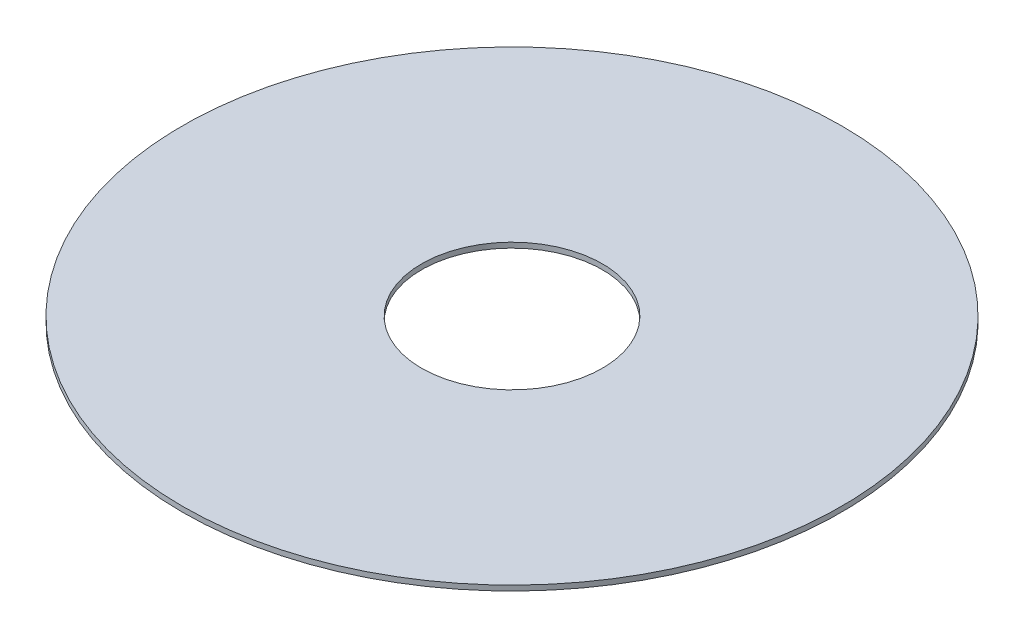
ISO-10303-21;
HEADER;
FILE_DESCRIPTION(('STEP AP214'),'2;1');
FILE_NAME('part.step','',(''),(''),'','','');
FILE_SCHEMA(('AUTOMOTIVE_DESIGN { 1 0 10303 214 1 1 1 1 }'));
ENDSEC;
DATA;
#1=APPLICATION_CONTEXT('core data for automotive mechanical design processes');
#2=APPLICATION_PROTOCOL_DEFINITION('international standard','automotive_design',2000,#1);
#3=PRODUCT_CONTEXT('',#1,'mechanical');
#4=PRODUCT('Part','Part','',(#3));
#5=PRODUCT_RELATED_PRODUCT_CATEGORY('part','',(#4));
#6=PRODUCT_DEFINITION_FORMATION('','',#4);
#7=PRODUCT_DEFINITION_CONTEXT('part definition',#1,'design');
#8=PRODUCT_DEFINITION('design','',#6,#7);
#9=PRODUCT_DEFINITION_SHAPE('','',#8);
#10=(LENGTH_UNIT() NAMED_UNIT(*) SI_UNIT(.MILLI.,.METRE.));
#11=(NAMED_UNIT(*) PLANE_ANGLE_UNIT() SI_UNIT($,.RADIAN.));
#12=(NAMED_UNIT(*) SI_UNIT($,.STERADIAN.) SOLID_ANGLE_UNIT());
#13=UNCERTAINTY_MEASURE_WITH_UNIT(LENGTH_MEASURE(1.E-05),#10,'distance_accuracy_value','');
#14=(GEOMETRIC_REPRESENTATION_CONTEXT(3) GLOBAL_UNCERTAINTY_ASSIGNED_CONTEXT((#13)) GLOBAL_UNIT_ASSIGNED_CONTEXT((#10,
#11,#12)) REPRESENTATION_CONTEXT('',''));
#15=CARTESIAN_POINT('',(0.,0.,0.));
#16=DIRECTION('',(0.,0.,1.));
#17=DIRECTION('',(1.,0.,0.));
#18=AXIS2_PLACEMENT_3D('',#15,#16,#17);
#19=CARTESIAN_POINT('',(0.,-0.1,0.));
#20=DIRECTION('',(0.,1.,0.));
#21=DIRECTION('',(0.,0.,1.));
#22=AXIS2_PLACEMENT_3D('',#19,#20,#21);
#23=CYLINDRICAL_SURFACE('',#22,12.75);
#24=CARTESIAN_POINT('',(0.,-0.1,0.));
#25=DIRECTION('',(0.,1.,0.));
#26=DIRECTION('',(0.,0.,1.));
#27=AXIS2_PLACEMENT_3D('',#24,#25,#26);
#28=CIRCLE('',#27,12.75);
#29=CARTESIAN_POINT('',(0.,-0.1,12.75));
#30=VERTEX_POINT('',#29);
#31=EDGE_CURVE('E10',#30,#30,#28,.T.);
#32=ORIENTED_EDGE('',*,*,#31,.T.);
#33=EDGE_LOOP('',(#32));
#34=FACE_BOUND('',#33,.T.);
#35=CARTESIAN_POINT('',(0.,0.1,0.));
#36=DIRECTION('',(0.,1.,0.));
#37=DIRECTION('',(0.,0.,1.));
#38=AXIS2_PLACEMENT_3D('',#35,#36,#37);
#39=CIRCLE('',#38,12.75);
#40=CARTESIAN_POINT('',(0.,0.1,12.75));
#41=VERTEX_POINT('',#40);
#42=EDGE_CURVE('E41',#41,#41,#39,.T.);
#43=ORIENTED_EDGE('',*,*,#42,.F.);
#44=EDGE_LOOP('',(#43));
#45=FACE_BOUND('',#44,.T.);
#46=ADVANCED_FACE('F31',(#34,#45),#23,.T.);
#47=CARTESIAN_POINT('',(0.,-0.1,0.));
#48=DIRECTION('',(0.,1.,0.));
#49=DIRECTION('',(0.,0.,1.));
#50=AXIS2_PLACEMENT_3D('',#47,#48,#49);
#51=PLANE('',#50);
#52=CARTESIAN_POINT('',(0.,-0.1,0.));
#53=DIRECTION('',(0.,1.,0.));
#54=DIRECTION('',(0.,0.,1.));
#55=AXIS2_PLACEMENT_3D('',#52,#53,#54);
#56=CIRCLE('',#55,3.5);
#57=CARTESIAN_POINT('',(0.,-0.1,3.5));
#58=VERTEX_POINT('',#57);
#59=EDGE_CURVE('E37',#58,#58,#56,.T.);
#60=ORIENTED_EDGE('',*,*,#59,.T.);
#61=EDGE_LOOP('',(#60));
#62=FACE_BOUND('',#61,.T.);
#63=ORIENTED_EDGE('',*,*,#31,.F.);
#64=EDGE_LOOP('',(#63));
#65=FACE_BOUND('',#64,.T.);
#66=ADVANCED_FACE('F60',(#62,#65),#51,.F.);
#67=CARTESIAN_POINT('',(0.,-0.1,0.));
#68=DIRECTION('',(0.,1.,0.));
#69=DIRECTION('',(0.,0.,1.));
#70=AXIS2_PLACEMENT_3D('',#67,#68,#69);
#71=CYLINDRICAL_SURFACE('',#70,3.5);
#72=ORIENTED_EDGE('',*,*,#59,.F.);
#73=EDGE_LOOP('',(#72));
#74=FACE_BOUND('',#73,.T.);
#75=CARTESIAN_POINT('',(0.,0.1,0.));
#76=DIRECTION('',(0.,1.,0.));
#77=DIRECTION('',(0.,0.,1.));
#78=AXIS2_PLACEMENT_3D('',#75,#76,#77);
#79=CIRCLE('',#78,3.5);
#80=CARTESIAN_POINT('',(0.,0.1,3.5));
#81=VERTEX_POINT('',#80);
#82=EDGE_CURVE('E45',#81,#81,#79,.T.);
#83=ORIENTED_EDGE('',*,*,#82,.T.);
#84=EDGE_LOOP('',(#83));
#85=FACE_BOUND('',#84,.T.);
#86=ADVANCED_FACE('F51',(#74,#85),#71,.F.);
#87=CARTESIAN_POINT('',(0.,0.1,0.));
#88=DIRECTION('',(0.,1.,0.));
#89=DIRECTION('',(0.,0.,1.));
#90=AXIS2_PLACEMENT_3D('',#87,#88,#89);
#91=PLANE('',#90);
#92=ORIENTED_EDGE('',*,*,#42,.T.);
#93=EDGE_LOOP('',(#92));
#94=FACE_BOUND('',#93,.T.);
#95=ORIENTED_EDGE('',*,*,#82,.F.);
#96=EDGE_LOOP('',(#95));
#97=FACE_BOUND('',#96,.T.);
#98=ADVANCED_FACE('F53',(#94,#97),#91,.T.);
#99=CLOSED_SHELL('',(#46,#66,#86,#98));
#100=MANIFOLD_SOLID_BREP('B2',#99);
#101=ADVANCED_BREP_SHAPE_REPRESENTATION('',(#18,#100),#14);
#102=SHAPE_DEFINITION_REPRESENTATION(#9,#101);
ENDSEC;
END-ISO-10303-21;
